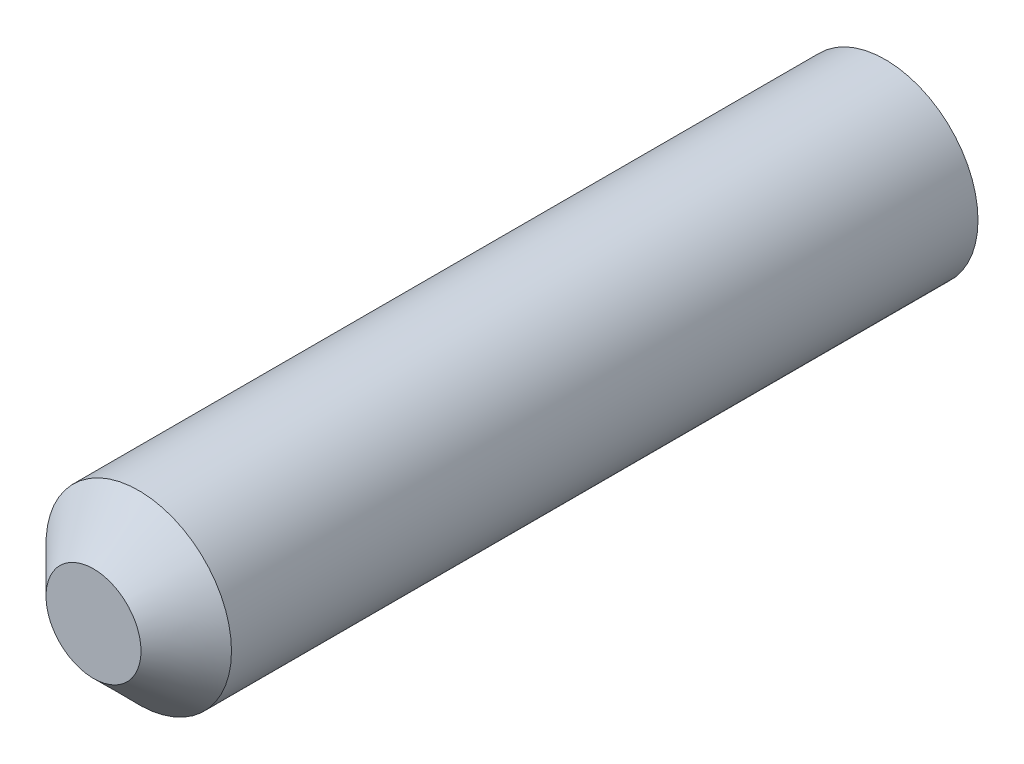
ISO-10303-21;
HEADER;
FILE_DESCRIPTION(('STEP AP214'),'2;1');
FILE_NAME('part.step','',(''),(''),'','','');
FILE_SCHEMA(('AUTOMOTIVE_DESIGN { 1 0 10303 214 1 1 1 1 }'));
ENDSEC;
DATA;
#1=APPLICATION_CONTEXT('core data for automotive mechanical design processes');
#2=APPLICATION_PROTOCOL_DEFINITION('international standard','automotive_design',2000,#1);
#3=PRODUCT_CONTEXT('',#1,'mechanical');
#4=PRODUCT('Part','Part','',(#3));
#5=PRODUCT_RELATED_PRODUCT_CATEGORY('part','',(#4));
#6=PRODUCT_DEFINITION_FORMATION('','',#4);
#7=PRODUCT_DEFINITION_CONTEXT('part definition',#1,'design');
#8=PRODUCT_DEFINITION('design','',#6,#7);
#9=PRODUCT_DEFINITION_SHAPE('','',#8);
#10=(LENGTH_UNIT() NAMED_UNIT(*) SI_UNIT(.MILLI.,.METRE.));
#11=(NAMED_UNIT(*) PLANE_ANGLE_UNIT() SI_UNIT($,.RADIAN.));
#12=(NAMED_UNIT(*) SI_UNIT($,.STERADIAN.) SOLID_ANGLE_UNIT());
#13=UNCERTAINTY_MEASURE_WITH_UNIT(LENGTH_MEASURE(1.E-05),#10,'distance_accuracy_value','');
#14=(GEOMETRIC_REPRESENTATION_CONTEXT(3) GLOBAL_UNCERTAINTY_ASSIGNED_CONTEXT((#13)) GLOBAL_UNIT_ASSIGNED_CONTEXT((#10,
#11,#12)) REPRESENTATION_CONTEXT('',''));
#15=CARTESIAN_POINT('',(0.,0.,0.));
#16=DIRECTION('',(0.,0.,1.));
#17=DIRECTION('',(1.,0.,0.));
#18=AXIS2_PLACEMENT_3D('',#15,#16,#17);
#19=CARTESIAN_POINT('',(0.,0.,17.5));
#20=DIRECTION('',(0.,0.,-1.));
#21=DIRECTION('',(-1.,0.,0.));
#22=AXIS2_PLACEMENT_3D('',#19,#20,#21);
#23=CYLINDRICAL_SURFACE('',#22,2.05);
#24=CARTESIAN_POINT('',(0.,0.,16.5));
#25=DIRECTION('',(0.,0.,1.));
#26=DIRECTION('',(1.,0.,0.));
#27=AXIS2_PLACEMENT_3D('',#24,#25,#26);
#28=CIRCLE('',#27,2.05);
#29=CARTESIAN_POINT('',(2.05,0.,16.5));
#30=VERTEX_POINT('',#29);
#31=EDGE_CURVE('E10',#30,#30,#28,.F.);
#32=ORIENTED_EDGE('',*,*,#31,.T.);
#33=EDGE_LOOP('',(#32));
#34=FACE_BOUND('',#33,.T.);
#35=CARTESIAN_POINT('',(0.,0.,0.));
#36=DIRECTION('',(0.,0.,1.));
#37=DIRECTION('',(1.,0.,0.));
#38=AXIS2_PLACEMENT_3D('',#35,#36,#37);
#39=CIRCLE('',#38,2.05);
#40=CARTESIAN_POINT('',(2.05,0.,0.));
#41=VERTEX_POINT('',#40);
#42=EDGE_CURVE('E49',#41,#41,#39,.T.);
#43=ORIENTED_EDGE('',*,*,#42,.T.);
#44=EDGE_LOOP('',(#43));
#45=FACE_BOUND('',#44,.T.);
#46=ADVANCED_FACE('F37',(#34,#45),#23,.T.);
#47=CARTESIAN_POINT('',(0.,0.,17.5));
#48=DIRECTION('',(0.,0.,1.));
#49=DIRECTION('',(1.,0.,0.));
#50=AXIS2_PLACEMENT_3D('',#47,#48,#49);
#51=PLANE('',#50);
#52=CARTESIAN_POINT('',(0.,0.,17.5));
#53=DIRECTION('',(0.,0.,1.));
#54=DIRECTION('',(1.,0.,0.));
#55=AXIS2_PLACEMENT_3D('',#52,#53,#54);
#56=CIRCLE('',#55,1.05);
#57=CARTESIAN_POINT('',(1.05,0.,17.5));
#58=VERTEX_POINT('',#57);
#59=EDGE_CURVE('E45',#58,#58,#56,.T.);
#60=ORIENTED_EDGE('',*,*,#59,.T.);
#61=EDGE_LOOP('',(#60));
#62=FACE_BOUND('',#61,.T.);
#63=ADVANCED_FACE('F59',(#62),#51,.T.);
#64=CARTESIAN_POINT('',(0.,0.,0.));
#65=DIRECTION('',(0.,0.,1.));
#66=DIRECTION('',(1.,0.,0.));
#67=AXIS2_PLACEMENT_3D('',#64,#65,#66);
#68=PLANE('',#67);
#69=ORIENTED_EDGE('',*,*,#42,.F.);
#70=EDGE_LOOP('',(#69));
#71=FACE_BOUND('',#70,.T.);
#72=ADVANCED_FACE('F57',(#71),#68,.F.);
#73=CARTESIAN_POINT('',(0.,0.,17.5));
#74=DIRECTION('',(0.,0.,-1.));
#75=DIRECTION('',(-1.,0.,0.));
#76=AXIS2_PLACEMENT_3D('',#73,#74,#75);
#77=CONICAL_SURFACE('',#76,1.05,0.785398163397447);
#78=ORIENTED_EDGE('',*,*,#31,.F.);
#79=EDGE_LOOP('',(#78));
#80=FACE_BOUND('',#79,.T.);
#81=ORIENTED_EDGE('',*,*,#59,.F.);
#82=EDGE_LOOP('',(#81));
#83=FACE_BOUND('',#82,.T.);
#84=ADVANCED_FACE('F40',(#80,#83),#77,.T.);
#85=CLOSED_SHELL('',(#46,#63,#72,#84));
#86=MANIFOLD_SOLID_BREP('B2',#85);
#87=ADVANCED_BREP_SHAPE_REPRESENTATION('',(#18,#86),#14);
#88=SHAPE_DEFINITION_REPRESENTATION(#9,#87);
ENDSEC;
END-ISO-10303-21;
